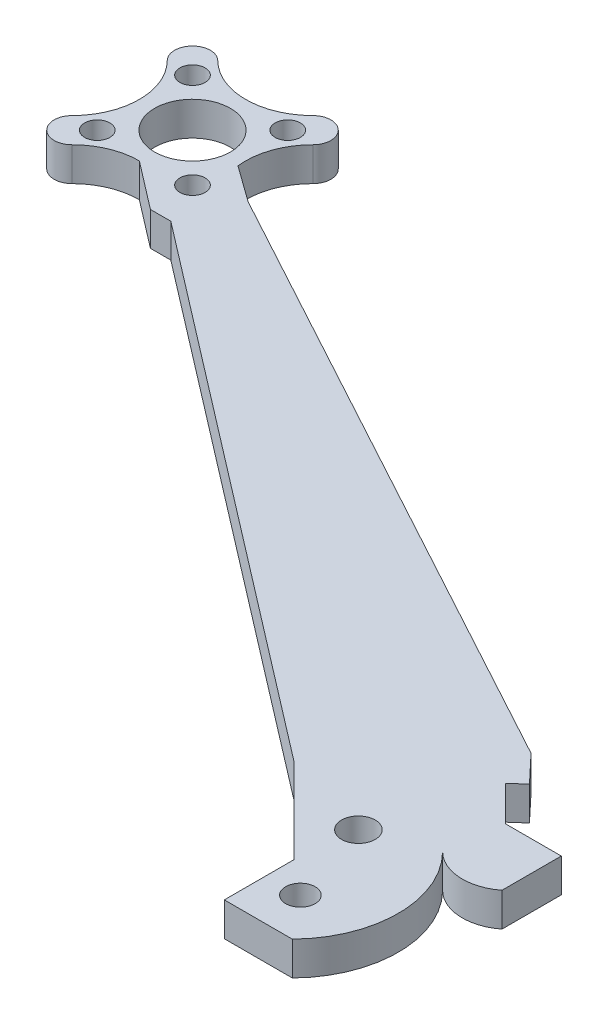
ISO-10303-21;
HEADER;
FILE_DESCRIPTION(('STEP AP214'),'2;1');
FILE_NAME('part.step','',(''),(''),'','','');
FILE_SCHEMA(('AUTOMOTIVE_DESIGN { 1 0 10303 214 1 1 1 1 }'));
ENDSEC;
DATA;
#1=APPLICATION_CONTEXT('core data for automotive mechanical design processes');
#2=APPLICATION_PROTOCOL_DEFINITION('international standard','automotive_design',2000,#1);
#3=PRODUCT_CONTEXT('',#1,'mechanical');
#4=PRODUCT('Part','Part','',(#3));
#5=PRODUCT_RELATED_PRODUCT_CATEGORY('part','',(#4));
#6=PRODUCT_DEFINITION_FORMATION('','',#4);
#7=PRODUCT_DEFINITION_CONTEXT('part definition',#1,'design');
#8=PRODUCT_DEFINITION('design','',#6,#7);
#9=PRODUCT_DEFINITION_SHAPE('','',#8);
#10=(LENGTH_UNIT() NAMED_UNIT(*) SI_UNIT(.MILLI.,.METRE.));
#11=(NAMED_UNIT(*) PLANE_ANGLE_UNIT() SI_UNIT($,.RADIAN.));
#12=(NAMED_UNIT(*) SI_UNIT($,.STERADIAN.) SOLID_ANGLE_UNIT());
#13=UNCERTAINTY_MEASURE_WITH_UNIT(LENGTH_MEASURE(1.E-05),#10,'distance_accuracy_value','');
#14=(GEOMETRIC_REPRESENTATION_CONTEXT(3) GLOBAL_UNCERTAINTY_ASSIGNED_CONTEXT((#13)) GLOBAL_UNIT_ASSIGNED_CONTEXT((#10,
#11,#12)) REPRESENTATION_CONTEXT('',''));
#15=CARTESIAN_POINT('',(0.,0.,0.));
#16=DIRECTION('',(0.,0.,1.));
#17=DIRECTION('',(1.,0.,0.));
#18=AXIS2_PLACEMENT_3D('',#15,#16,#17);
#19=CARTESIAN_POINT('',(0.,4.,0.));
#20=DIRECTION('',(0.,1.,0.));
#21=DIRECTION('',(0.,0.,1.));
#22=AXIS2_PLACEMENT_3D('',#19,#20,#21);
#23=PLANE('',#22);
#24=CARTESIAN_POINT('',(85.0978041056994,4.,72.2825680687124));
#25=DIRECTION('',(0.,-1.,0.));
#26=DIRECTION('',(0.,0.,-1.));
#27=AXIS2_PLACEMENT_3D('',#24,#25,#26);
#28=CIRCLE('',#27,1.75);
#29=CARTESIAN_POINT('',(85.0978041056994,4.,70.5325680687124));
#30=VERTEX_POINT('',#29);
#31=EDGE_CURVE('E846',#30,#30,#28,.T.);
#32=ORIENTED_EDGE('',*,*,#31,.T.);
#33=EDGE_LOOP('',(#32));
#34=FACE_BOUND('',#33,.T.);
#35=CARTESIAN_POINT('',(81.80780567727,4.,62.1037977929157));
#36=DIRECTION('',(0.,1.,0.));
#37=DIRECTION('',(0.,0.,1.));
#38=AXIS2_PLACEMENT_3D('',#35,#36,#37);
#39=CIRCLE('',#38,1.99999999999999);
#40=CARTESIAN_POINT('',(81.80780567727,4.,64.1037977929157));
#41=VERTEX_POINT('',#40);
#42=EDGE_CURVE('E223',#41,#41,#39,.T.);
#43=ORIENTED_EDGE('',*,*,#42,.F.);
#44=EDGE_LOOP('',(#43));
#45=FACE_BOUND('',#44,.T.);
#46=CARTESIAN_POINT('',(-5.65685424949232,4.,-5.65685424949244));
#47=DIRECTION('',(0.,1.,0.));
#48=DIRECTION('',(0.,0.,1.));
#49=AXIS2_PLACEMENT_3D('',#46,#47,#48);
#50=CIRCLE('',#49,1.5);
#51=CARTESIAN_POINT('',(-5.65685424949232,4.,-4.15685424949244));
#52=VERTEX_POINT('',#51);
#53=EDGE_CURVE('E442',#52,#52,#50,.T.);
#54=ORIENTED_EDGE('',*,*,#53,.F.);
#55=EDGE_LOOP('',(#54));
#56=FACE_BOUND('',#55,.T.);
#57=CARTESIAN_POINT('',(-5.65685424949242,4.,5.65685424949234));
#58=DIRECTION('',(0.,1.,0.));
#59=DIRECTION('',(0.,0.,1.));
#60=AXIS2_PLACEMENT_3D('',#57,#58,#59);
#61=CIRCLE('',#60,1.5);
#62=CARTESIAN_POINT('',(-5.65685424949242,4.,7.15685424949234));
#63=VERTEX_POINT('',#62);
#64=EDGE_CURVE('E434',#63,#63,#61,.T.);
#65=ORIENTED_EDGE('',*,*,#64,.F.);
#66=EDGE_LOOP('',(#65));
#67=FACE_BOUND('',#66,.T.);
#68=CARTESIAN_POINT('',(5.65685424949238,4.,-5.65685424949238));
#69=DIRECTION('',(0.,1.,0.));
#70=DIRECTION('',(0.,0.,1.));
#71=AXIS2_PLACEMENT_3D('',#68,#69,#70);
#72=CIRCLE('',#71,1.5);
#73=CARTESIAN_POINT('',(5.65685424949238,4.,-4.15685424949238));
#74=VERTEX_POINT('',#73);
#75=EDGE_CURVE('E427',#74,#74,#72,.T.);
#76=ORIENTED_EDGE('',*,*,#75,.F.);
#77=EDGE_LOOP('',(#76));
#78=FACE_BOUND('',#77,.T.);
#79=CARTESIAN_POINT('',(0.,4.,0.));
#80=DIRECTION('',(0.,1.,0.));
#81=DIRECTION('',(0.,0.,1.));
#82=AXIS2_PLACEMENT_3D('',#79,#80,#81);
#83=CIRCLE('',#82,4.5);
#84=CARTESIAN_POINT('',(0.,4.,4.5));
#85=VERTEX_POINT('',#84);
#86=EDGE_CURVE('E456',#85,#85,#83,.T.);
#87=ORIENTED_EDGE('',*,*,#86,.F.);
#88=EDGE_LOOP('',(#87));
#89=FACE_BOUND('',#88,.T.);
#90=CARTESIAN_POINT('',(5.65685424949236,4.,5.6568542494924));
#91=DIRECTION('',(0.,1.,0.));
#92=DIRECTION('',(0.,0.,1.));
#93=AXIS2_PLACEMENT_3D('',#90,#91,#92);
#94=CIRCLE('',#93,1.5);
#95=CARTESIAN_POINT('',(5.65685424949236,4.,7.1568542494924));
#96=VERTEX_POINT('',#95);
#97=EDGE_CURVE('E428',#96,#96,#94,.T.);
#98=ORIENTED_EDGE('',*,*,#97,.F.);
#99=EDGE_LOOP('',(#98));
#100=FACE_BOUND('',#99,.T.);
#101=CARTESIAN_POINT('',(80.0614070112013,4.,68.3559558555536));
#102=DIRECTION('',(0.,-1.,0.));
#103=DIRECTION('',(0.,0.,-1.));
#104=AXIS2_PLACEMENT_3D('',#101,#102,#103);
#105=CIRCLE('',#104,12.7279220613578);
#106=CARTESIAN_POINT('',(89.0614070112014,4.,59.3559558555538));
#107=VERTEX_POINT('',#106);
#108=CARTESIAN_POINT('',(89.1342012001975,4.,77.2825680687124));
#109=VERTEX_POINT('',#108);
#110=EDGE_CURVE('E65',#107,#109,#105,.T.);
#111=ORIENTED_EDGE('',*,*,#110,.F.);
#112=CARTESIAN_POINT('',(93.0614070112013,4.,55.3559558555539));
#113=DIRECTION('',(0.,1.,0.));
#114=DIRECTION('',(0.,0.,1.));
#115=AXIS2_PLACEMENT_3D('',#112,#113,#114);
#116=CIRCLE('',#115,5.65685424949223);
#117=CARTESIAN_POINT('',(96.5614070112013,4.,59.8000530642115));
#118=VERTEX_POINT('',#117);
#119=EDGE_CURVE('E205',#107,#118,#116,.T.);
#120=ORIENTED_EDGE('',*,*,#119,.T.);
#121=DIRECTION('',(0.,0.,-1.));
#122=VECTOR('',#121,1.);
#123=CARTESIAN_POINT('',(96.5614070112013,4.,52.7610345676334));
#124=LINE('',#123,#122);
#125=CARTESIAN_POINT('',(96.5614070112013,4.,52.7610345676334));
#126=VERTEX_POINT('',#125);
#127=EDGE_CURVE('E332',#118,#126,#124,.T.);
#128=ORIENTED_EDGE('',*,*,#127,.T.);
#129=DIRECTION('',(1.,0.,0.));
#130=VECTOR('',#129,1.);
#131=CARTESIAN_POINT('',(90.5019503136648,4.,52.7610345676334));
#132=LINE('',#131,#130);
#133=CARTESIAN_POINT('',(89.9608894690823,4.,52.7610345676334));
#134=VERTEX_POINT('',#133);
#135=EDGE_CURVE('E354',#134,#126,#132,.T.);
#136=ORIENTED_EDGE('',*,*,#135,.F.);
#137=DIRECTION('',(0.707331619227857,0.,0.706881871630966));
#138=VECTOR('',#137,1.);
#139=CARTESIAN_POINT('',(85.7805147252344,4.,48.5833178606157));
#140=LINE('',#139,#138);
#141=CARTESIAN_POINT('',(85.7805147252344,4.,48.5833178606157));
#142=VERTEX_POINT('',#141);
#143=EDGE_CURVE('E366',#142,#134,#140,.T.);
#144=ORIENTED_EDGE('',*,*,#143,.F.);
#145=DIRECTION('',(-0.749062373849123,0.,0.66249947930811));
#146=VECTOR('',#145,1.);
#147=CARTESIAN_POINT('',(87.2786394729325,4.,47.2583189019996));
#148=LINE('',#147,#146);
#149=CARTESIAN_POINT('',(87.2786394729325,4.,47.2583189019996));
#150=VERTEX_POINT('',#149);
#151=EDGE_CURVE('E348',#150,#142,#148,.T.);
#152=ORIENTED_EDGE('',*,*,#151,.F.);
#153=DIRECTION('',(-0.685611663685296,0.,-0.727967476346767));
#154=VECTOR('',#153,1.);
#155=CARTESIAN_POINT('',(87.2786394729325,4.,47.2583189019996));
#156=LINE('',#155,#154);
#157=CARTESIAN_POINT('',(84.1934838147439,4.,43.9825680687124));
#158=VERTEX_POINT('',#157);
#159=EDGE_CURVE('E291',#150,#158,#156,.T.);
#160=ORIENTED_EDGE('',*,*,#159,.T.);
#161=DIRECTION('',(-0.878817112661968,0.,-0.477158760259604));
#162=VECTOR('',#161,1.);
#163=CARTESIAN_POINT('',(84.1934838147439,4.,43.9825680687124));
#164=LINE('',#163,#162);
#165=CARTESIAN_POINT('',(10.655,4.,4.05442913872873));
#166=VERTEX_POINT('',#165);
#167=EDGE_CURVE('E380',#158,#166,#164,.T.);
#168=ORIENTED_EDGE('',*,*,#167,.T.);
#169=DIRECTION('',(-0.811476008534574,0.,-0.584385735257797));
#170=VECTOR('',#169,1.);
#171=CARTESIAN_POINT('',(6.37280582790223,4.,0.970600210382307));
#172=LINE('',#171,#170);
#173=CARTESIAN_POINT('',(6.37280582790223,4.,0.970600210382307));
#174=VERTEX_POINT('',#173);
#175=EDGE_CURVE('E203',#166,#174,#172,.T.);
#176=ORIENTED_EDGE('',*,*,#175,.T.);
#177=CARTESIAN_POINT('',(14.3137084989848,4.,0.));
#178=DIRECTION('',(0.,-1.,0.));
#179=DIRECTION('',(0.,0.,1.));
#180=AXIS2_PLACEMENT_3D('',#177,#178,#179);
#181=CIRCLE('',#180,7.99999999999998);
#182=CARTESIAN_POINT('',(8.65685424949238,4.,-5.65685424949238));
#183=VERTEX_POINT('',#182);
#184=EDGE_CURVE('E300',#174,#183,#181,.T.);
#185=ORIENTED_EDGE('',*,*,#184,.T.);
#186=CARTESIAN_POINT('',(7.15685424949238,4.,-7.15685424949241));
#187=DIRECTION('',(0.,1.,0.));
#188=DIRECTION('',(0.,0.,-1.));
#189=AXIS2_PLACEMENT_3D('',#186,#187,#188);
#190=CIRCLE('',#189,2.12132034355966);
#191=CARTESIAN_POINT('',(5.65685424949238,4.,-8.65685424949244));
#192=VERTEX_POINT('',#191);
#193=EDGE_CURVE('E297',#183,#192,#190,.T.);
#194=ORIENTED_EDGE('',*,*,#193,.T.);
#195=CARTESIAN_POINT('',(0.,4.,-14.3137084989848));
#196=DIRECTION('',(0.,-1.,0.));
#197=DIRECTION('',(0.,0.,-1.));
#198=AXIS2_PLACEMENT_3D('',#195,#196,#197);
#199=CIRCLE('',#198,7.99999999999996);
#200=CARTESIAN_POINT('',(-5.65685424949232,4.,-8.65685424949244));
#201=VERTEX_POINT('',#200);
#202=EDGE_CURVE('E255',#192,#201,#199,.T.);
#203=ORIENTED_EDGE('',*,*,#202,.T.);
#204=CARTESIAN_POINT('',(-7.15685424949232,4.,-7.15685424949244));
#205=DIRECTION('',(0.,1.,0.));
#206=DIRECTION('',(0.,0.,-1.));
#207=AXIS2_PLACEMENT_3D('',#204,#205,#206);
#208=CIRCLE('',#207,2.12132034355964);
#209=CARTESIAN_POINT('',(-8.65685424949232,4.,-5.65685424949244));
#210=VERTEX_POINT('',#209);
#211=EDGE_CURVE('E244',#201,#210,#208,.T.);
#212=ORIENTED_EDGE('',*,*,#211,.T.);
#213=CARTESIAN_POINT('',(-14.3137084989847,4.,0.));
#214=DIRECTION('',(0.,-1.,0.));
#215=DIRECTION('',(0.,0.,-1.));
#216=AXIS2_PLACEMENT_3D('',#213,#214,#215);
#217=CIRCLE('',#216,8.00000000000002);
#218=CARTESIAN_POINT('',(-8.65685424949232,4.,5.65685424949234));
#219=VERTEX_POINT('',#218);
#220=EDGE_CURVE('E283',#210,#219,#217,.T.);
#221=ORIENTED_EDGE('',*,*,#220,.T.);
#222=CARTESIAN_POINT('',(-7.15685424949237,4.,7.15685424949234));
#223=DIRECTION('',(0.,1.,0.));
#224=DIRECTION('',(0.,0.,1.));
#225=AXIS2_PLACEMENT_3D('',#222,#223,#224);
#226=CIRCLE('',#225,2.12132034355961);
#227=CARTESIAN_POINT('',(-5.65685424949242,4.,8.65685424949234));
#228=VERTEX_POINT('',#227);
#229=EDGE_CURVE('E284',#219,#228,#226,.T.);
#230=ORIENTED_EDGE('',*,*,#229,.T.);
#231=CARTESIAN_POINT('',(0.,4.,14.3137084989848));
#232=DIRECTION('',(0.,-1.,0.));
#233=DIRECTION('',(0.,0.,-1.));
#234=AXIS2_PLACEMENT_3D('',#231,#232,#233);
#235=CIRCLE('',#234,8.00000000000003);
#236=CARTESIAN_POINT('',(0.,4.,6.31370849898472));
#237=VERTEX_POINT('',#236);
#238=EDGE_CURVE('E288',#228,#237,#235,.T.);
#239=ORIENTED_EDGE('',*,*,#238,.T.);
#240=DIRECTION('',(0.793310358918495,0.,0.608817439330222));
#241=VECTOR('',#240,1.);
#242=CARTESIAN_POINT('',(5.65685424949236,4.,10.655));
#243=LINE('',#242,#241);
#244=CARTESIAN_POINT('',(5.65685424949236,4.,10.655));
#245=VERTEX_POINT('',#244);
#246=EDGE_CURVE('E235',#237,#245,#243,.T.);
#247=ORIENTED_EDGE('',*,*,#246,.T.);
#248=DIRECTION('',(1.,0.,0.));
#249=VECTOR('',#248,1.);
#250=CARTESIAN_POINT('',(0.,4.,10.655));
#251=LINE('',#250,#249);
#252=CARTESIAN_POINT('',(8.07969409634453,4.,10.655));
#253=VERTEX_POINT('',#252);
#254=EDGE_CURVE('E411',#245,#253,#251,.T.);
#255=ORIENTED_EDGE('',*,*,#254,.T.);
#256=DIRECTION('',(0.793353340291236,0.,0.60876142900872));
#257=VECTOR('',#256,1.);
#258=CARTESIAN_POINT('',(71.0614070112013,4.,58.9825680687125));
#259=LINE('',#258,#257);
#260=CARTESIAN_POINT('',(71.0614070112013,4.,58.9825680687125));
#261=VERTEX_POINT('',#260);
#262=EDGE_CURVE('E402',#253,#261,#259,.T.);
#263=ORIENTED_EDGE('',*,*,#262,.T.);
#264=DIRECTION('',(0.707106781186547,0.,0.707106781186548));
#265=VECTOR('',#264,1.);
#266=CARTESIAN_POINT('',(71.0614070112013,4.,58.9825680687125));
#267=LINE('',#266,#265);
#268=CARTESIAN_POINT('',(81.0614070112013,4.,68.9825680687125));
#269=VERTEX_POINT('',#268);
#270=EDGE_CURVE('E404',#261,#269,#267,.T.);
#271=ORIENTED_EDGE('',*,*,#270,.T.);
#272=DIRECTION('',(0.,0.,1.));
#273=VECTOR('',#272,1.);
#274=CARTESIAN_POINT('',(81.0614070112013,4.,68.9825680687125));
#275=LINE('',#274,#273);
#276=CARTESIAN_POINT('',(81.0614070112013,4.,77.2825680687124));
#277=VERTEX_POINT('',#276);
#278=EDGE_CURVE('E386',#269,#277,#275,.T.);
#279=ORIENTED_EDGE('',*,*,#278,.T.);
#280=DIRECTION('',(1.,0.,0.));
#281=VECTOR('',#280,1.);
#282=CARTESIAN_POINT('',(81.0614070112013,4.,77.2825680687124));
#283=LINE('',#282,#281);
#284=EDGE_CURVE('E309',#277,#109,#283,.T.);
#285=ORIENTED_EDGE('',*,*,#284,.T.);
#286=EDGE_LOOP('',(#111,#120,#128,#136,#144,#152,#160,#168,#176,#185,#194,#203,#212,#221,#230,
#239,#247,#255,#263,#271,#279,#285));
#287=FACE_BOUND('',#286,.T.);
#288=ADVANCED_FACE('F50',(#34,#45,#56,#67,#78,#89,#100,#287),#23,.T.);
#289=CARTESIAN_POINT('',(96.5614070112013,0.,52.7610345676334));
#290=DIRECTION('',(1.,0.,0.));
#291=DIRECTION('',(0.,0.,-1.));
#292=AXIS2_PLACEMENT_3D('',#289,#290,#291);
#293=PLANE('',#292);
#294=ORIENTED_EDGE('',*,*,#127,.F.);
#295=DIRECTION('',(0.,1.,0.));
#296=VECTOR('',#295,1.);
#297=CARTESIAN_POINT('',(96.5614070112013,0.,59.8000530642115));
#298=LINE('',#297,#296);
#299=CARTESIAN_POINT('',(96.5614070112013,0.,59.8000530642115));
#300=VERTEX_POINT('',#299);
#301=EDGE_CURVE('E12',#118,#300,#298,.F.);
#302=ORIENTED_EDGE('',*,*,#301,.T.);
#303=DIRECTION('',(0.,0.,-1.));
#304=VECTOR('',#303,1.);
#305=CARTESIAN_POINT('',(96.5614070112013,0.,52.7610345676334));
#306=LINE('',#305,#304);
#307=CARTESIAN_POINT('',(96.5614070112013,0.,52.7610345676334));
#308=VERTEX_POINT('',#307);
#309=EDGE_CURVE('E220',#300,#308,#306,.T.);
#310=ORIENTED_EDGE('',*,*,#309,.T.);
#311=DIRECTION('',(0.,1.,0.));
#312=VECTOR('',#311,1.);
#313=CARTESIAN_POINT('',(96.5614070112013,0.,52.7610345676334));
#314=LINE('',#313,#312);
#315=EDGE_CURVE('E341',#308,#126,#314,.T.);
#316=ORIENTED_EDGE('',*,*,#315,.T.);
#317=EDGE_LOOP('',(#294,#302,#310,#316));
#318=FACE_BOUND('',#317,.T.);
#319=ADVANCED_FACE('F543',(#318),#293,.T.);
#320=CARTESIAN_POINT('',(0.,0.,0.));
#321=DIRECTION('',(0.,1.,0.));
#322=DIRECTION('',(0.,0.,1.));
#323=AXIS2_PLACEMENT_3D('',#320,#321,#322);
#324=PLANE('',#323);
#325=CARTESIAN_POINT('',(85.0978041056994,0.,72.2825680687124));
#326=DIRECTION('',(0.,-1.,0.));
#327=DIRECTION('',(0.,0.,-1.));
#328=AXIS2_PLACEMENT_3D('',#325,#326,#327);
#329=CIRCLE('',#328,1.75);
#330=CARTESIAN_POINT('',(85.0978041056994,0.,70.5325680687124));
#331=VERTEX_POINT('',#330);
#332=EDGE_CURVE('E841',#331,#331,#329,.T.);
#333=ORIENTED_EDGE('',*,*,#332,.F.);
#334=EDGE_LOOP('',(#333));
#335=FACE_BOUND('',#334,.T.);
#336=CARTESIAN_POINT('',(81.80780567727,0.,62.1037977929157));
#337=DIRECTION('',(0.,-1.,0.));
#338=DIRECTION('',(0.,0.,-1.));
#339=AXIS2_PLACEMENT_3D('',#336,#337,#338);
#340=CIRCLE('',#339,1.99999999999999);
#341=CARTESIAN_POINT('',(81.80780567727,0.,60.1037977929157));
#342=VERTEX_POINT('',#341);
#343=EDGE_CURVE('E842',#342,#342,#340,.T.);
#344=ORIENTED_EDGE('',*,*,#343,.F.);
#345=EDGE_LOOP('',(#344));
#346=FACE_BOUND('',#345,.T.);
#347=CARTESIAN_POINT('',(93.0614070112013,0.,55.3559558555539));
#348=DIRECTION('',(0.,1.,0.));
#349=DIRECTION('',(0.,0.,1.));
#350=AXIS2_PLACEMENT_3D('',#347,#348,#349);
#351=CIRCLE('',#350,5.65685424949223);
#352=CARTESIAN_POINT('',(89.0614070112014,0.,59.3559558555538));
#353=VERTEX_POINT('',#352);
#354=EDGE_CURVE('E199',#353,#300,#351,.T.);
#355=ORIENTED_EDGE('',*,*,#354,.F.);
#356=CARTESIAN_POINT('',(80.0614070112013,0.,68.3559558555536));
#357=DIRECTION('',(0.,-1.,0.));
#358=DIRECTION('',(0.,0.,-1.));
#359=AXIS2_PLACEMENT_3D('',#356,#357,#358);
#360=CIRCLE('',#359,12.7279220613578);
#361=CARTESIAN_POINT('',(89.1342012001975,0.,77.2825680687124));
#362=VERTEX_POINT('',#361);
#363=EDGE_CURVE('E210',#353,#362,#360,.T.);
#364=ORIENTED_EDGE('',*,*,#363,.T.);
#365=DIRECTION('',(1.,0.,0.));
#366=VECTOR('',#365,1.);
#367=CARTESIAN_POINT('',(81.0614070112013,0.,77.2825680687124));
#368=LINE('',#367,#366);
#369=CARTESIAN_POINT('',(81.0614070112013,0.,77.2825680687124));
#370=VERTEX_POINT('',#369);
#371=EDGE_CURVE('E329',#370,#362,#368,.T.);
#372=ORIENTED_EDGE('',*,*,#371,.F.);
#373=DIRECTION('',(0.,0.,1.));
#374=VECTOR('',#373,1.);
#375=CARTESIAN_POINT('',(81.0614070112013,0.,68.9825680687125));
#376=LINE('',#375,#374);
#377=CARTESIAN_POINT('',(81.0614070112013,0.,68.9825680687125));
#378=VERTEX_POINT('',#377);
#379=EDGE_CURVE('E392',#378,#370,#376,.T.);
#380=ORIENTED_EDGE('',*,*,#379,.F.);
#381=DIRECTION('',(0.707106781186547,0.,0.707106781186548));
#382=VECTOR('',#381,1.);
#383=CARTESIAN_POINT('',(71.0614070112013,0.,58.9825680687125));
#384=LINE('',#383,#382);
#385=CARTESIAN_POINT('',(71.0614070112013,0.,58.9825680687125));
#386=VERTEX_POINT('',#385);
#387=EDGE_CURVE('E387',#386,#378,#384,.T.);
#388=ORIENTED_EDGE('',*,*,#387,.F.);
#389=DIRECTION('',(0.793353340291236,0.,0.60876142900872));
#390=VECTOR('',#389,1.);
#391=CARTESIAN_POINT('',(71.0614070112013,0.,58.9825680687125));
#392=LINE('',#391,#390);
#393=CARTESIAN_POINT('',(8.07969409634453,0.,10.655));
#394=VERTEX_POINT('',#393);
#395=EDGE_CURVE('E389',#394,#386,#392,.T.);
#396=ORIENTED_EDGE('',*,*,#395,.F.);
#397=DIRECTION('',(1.,0.,0.));
#398=VECTOR('',#397,1.);
#399=CARTESIAN_POINT('',(0.,0.,10.655));
#400=LINE('',#399,#398);
#401=CARTESIAN_POINT('',(5.65685424949236,0.,10.655));
#402=VERTEX_POINT('',#401);
#403=EDGE_CURVE('E419',#402,#394,#400,.T.);
#404=ORIENTED_EDGE('',*,*,#403,.F.);
#405=DIRECTION('',(0.793310358918495,0.,0.608817439330222));
#406=VECTOR('',#405,1.);
#407=CARTESIAN_POINT('',(5.65685424949236,0.,10.655));
#408=LINE('',#407,#406);
#409=CARTESIAN_POINT('',(0.,0.,6.31370849898472));
#410=VERTEX_POINT('',#409);
#411=EDGE_CURVE('E233',#410,#402,#408,.T.);
#412=ORIENTED_EDGE('',*,*,#411,.F.);
#413=CARTESIAN_POINT('',(0.,0.,14.3137084989848));
#414=DIRECTION('',(0.,-1.,0.));
#415=DIRECTION('',(0.,0.,-1.));
#416=AXIS2_PLACEMENT_3D('',#413,#414,#415);
#417=CIRCLE('',#416,8.00000000000003);
#418=CARTESIAN_POINT('',(-5.65685424949242,0.,8.65685424949234));
#419=VERTEX_POINT('',#418);
#420=EDGE_CURVE('E257',#419,#410,#417,.T.);
#421=ORIENTED_EDGE('',*,*,#420,.F.);
#422=CARTESIAN_POINT('',(-7.15685424949237,0.,7.15685424949234));
#423=DIRECTION('',(0.,1.,0.));
#424=DIRECTION('',(0.,0.,1.));
#425=AXIS2_PLACEMENT_3D('',#422,#423,#424);
#426=CIRCLE('',#425,2.12132034355961);
#427=CARTESIAN_POINT('',(-8.65685424949232,0.,5.65685424949234));
#428=VERTEX_POINT('',#427);
#429=EDGE_CURVE('E259',#428,#419,#426,.T.);
#430=ORIENTED_EDGE('',*,*,#429,.F.);
#431=CARTESIAN_POINT('',(-14.3137084989847,0.,0.));
#432=DIRECTION('',(0.,-1.,0.));
#433=DIRECTION('',(0.,0.,-1.));
#434=AXIS2_PLACEMENT_3D('',#431,#432,#433);
#435=CIRCLE('',#434,8.00000000000002);
#436=CARTESIAN_POINT('',(-8.65685424949232,0.,-5.65685424949244));
#437=VERTEX_POINT('',#436);
#438=EDGE_CURVE('E252',#437,#428,#435,.T.);
#439=ORIENTED_EDGE('',*,*,#438,.F.);
#440=CARTESIAN_POINT('',(-7.15685424949232,0.,-7.15685424949244));
#441=DIRECTION('',(0.,1.,0.));
#442=DIRECTION('',(0.,0.,-1.));
#443=AXIS2_PLACEMENT_3D('',#440,#441,#442);
#444=CIRCLE('',#443,2.12132034355964);
#445=CARTESIAN_POINT('',(-5.65685424949232,0.,-8.65685424949244));
#446=VERTEX_POINT('',#445);
#447=EDGE_CURVE('E247',#446,#437,#444,.T.);
#448=ORIENTED_EDGE('',*,*,#447,.F.);
#449=CARTESIAN_POINT('',(0.,0.,-14.3137084989848));
#450=DIRECTION('',(0.,-1.,0.));
#451=DIRECTION('',(0.,0.,-1.));
#452=AXIS2_PLACEMENT_3D('',#449,#450,#451);
#453=CIRCLE('',#452,7.99999999999996);
#454=CARTESIAN_POINT('',(5.65685424949238,0.,-8.65685424949244));
#455=VERTEX_POINT('',#454);
#456=EDGE_CURVE('E271',#455,#446,#453,.T.);
#457=ORIENTED_EDGE('',*,*,#456,.F.);
#458=CARTESIAN_POINT('',(7.15685424949238,0.,-7.15685424949241));
#459=DIRECTION('',(0.,1.,0.));
#460=DIRECTION('',(0.,0.,-1.));
#461=AXIS2_PLACEMENT_3D('',#458,#459,#460);
#462=CIRCLE('',#461,2.12132034355966);
#463=CARTESIAN_POINT('',(8.65685424949238,0.,-5.65685424949238));
#464=VERTEX_POINT('',#463);
#465=EDGE_CURVE('E268',#464,#455,#462,.T.);
#466=ORIENTED_EDGE('',*,*,#465,.F.);
#467=CARTESIAN_POINT('',(14.3137084989848,0.,0.));
#468=DIRECTION('',(0.,-1.,0.));
#469=DIRECTION('',(0.,0.,1.));
#470=AXIS2_PLACEMENT_3D('',#467,#468,#469);
#471=CIRCLE('',#470,7.99999999999998);
#472=CARTESIAN_POINT('',(6.37280582790223,0.,0.970600210382307));
#473=VERTEX_POINT('',#472);
#474=EDGE_CURVE('E266',#473,#464,#471,.T.);
#475=ORIENTED_EDGE('',*,*,#474,.F.);
#476=DIRECTION('',(-0.811476008534574,0.,-0.584385735257797));
#477=VECTOR('',#476,1.);
#478=CARTESIAN_POINT('',(6.37280582790223,0.,0.970600210382307));
#479=LINE('',#478,#477);
#480=CARTESIAN_POINT('',(10.655,0.,4.05442913872873));
#481=VERTEX_POINT('',#480);
#482=EDGE_CURVE('E227',#481,#473,#479,.T.);
#483=ORIENTED_EDGE('',*,*,#482,.F.);
#484=DIRECTION('',(-0.878817112661968,0.,-0.477158760259604));
#485=VECTOR('',#484,1.);
#486=CARTESIAN_POINT('',(84.1934838147439,0.,43.9825680687124));
#487=LINE('',#486,#485);
#488=CARTESIAN_POINT('',(84.1934838147439,0.,43.9825680687124));
#489=VERTEX_POINT('',#488);
#490=EDGE_CURVE('E384',#489,#481,#487,.T.);
#491=ORIENTED_EDGE('',*,*,#490,.F.);
#492=DIRECTION('',(-0.685611663685296,0.,-0.727967476346767));
#493=VECTOR('',#492,1.);
#494=CARTESIAN_POINT('',(87.2786394729325,0.,47.2583189019996));
#495=LINE('',#494,#493);
#496=CARTESIAN_POINT('',(87.2786394729325,0.,47.2583189019996));
#497=VERTEX_POINT('',#496);
#498=EDGE_CURVE('E261',#497,#489,#495,.T.);
#499=ORIENTED_EDGE('',*,*,#498,.F.);
#500=DIRECTION('',(-0.749062373849123,0.,0.66249947930811));
#501=VECTOR('',#500,1.);
#502=CARTESIAN_POINT('',(87.2786394729325,0.,47.2583189019996));
#503=LINE('',#502,#501);
#504=CARTESIAN_POINT('',(85.7805147252344,0.,48.5833178606157));
#505=VERTEX_POINT('',#504);
#506=EDGE_CURVE('E349',#497,#505,#503,.T.);
#507=ORIENTED_EDGE('',*,*,#506,.T.);
#508=DIRECTION('',(0.707331619227857,0.,0.706881871630966));
#509=VECTOR('',#508,1.);
#510=CARTESIAN_POINT('',(85.7805147252344,0.,48.5833178606157));
#511=LINE('',#510,#509);
#512=CARTESIAN_POINT('',(89.9608894690823,0.,52.7610345676334));
#513=VERTEX_POINT('',#512);
#514=EDGE_CURVE('E353',#505,#513,#511,.T.);
#515=ORIENTED_EDGE('',*,*,#514,.T.);
#516=DIRECTION('',(1.,0.,0.));
#517=VECTOR('',#516,1.);
#518=CARTESIAN_POINT('',(89.9608894690823,0.,52.7610345676334));
#519=LINE('',#518,#517);
#520=EDGE_CURVE('E360',#513,#308,#519,.T.);
#521=ORIENTED_EDGE('',*,*,#520,.T.);
#522=ORIENTED_EDGE('',*,*,#309,.F.);
#523=EDGE_LOOP('',(#355,#364,#372,#380,#388,#396,#404,#412,#421,#430,#439,#448,#457,#466,#475,
#483,#491,#499,#507,#515,#521,#522));
#524=FACE_BOUND('',#523,.T.);
#525=CARTESIAN_POINT('',(-5.65685424949232,0.,-5.65685424949244));
#526=DIRECTION('',(0.,1.,0.));
#527=DIRECTION('',(0.,0.,1.));
#528=AXIS2_PLACEMENT_3D('',#525,#526,#527);
#529=CIRCLE('',#528,1.5);
#530=CARTESIAN_POINT('',(-5.65685424949232,0.,-4.15685424949244));
#531=VERTEX_POINT('',#530);
#532=EDGE_CURVE('E421',#531,#531,#529,.T.);
#533=ORIENTED_EDGE('',*,*,#532,.T.);
#534=EDGE_LOOP('',(#533));
#535=FACE_BOUND('',#534,.T.);
#536=CARTESIAN_POINT('',(-5.65685424949242,0.,5.65685424949234));
#537=DIRECTION('',(0.,1.,0.));
#538=DIRECTION('',(0.,0.,1.));
#539=AXIS2_PLACEMENT_3D('',#536,#537,#538);
#540=CIRCLE('',#539,1.5);
#541=CARTESIAN_POINT('',(-5.65685424949242,0.,7.15685424949234));
#542=VERTEX_POINT('',#541);
#543=EDGE_CURVE('E437',#542,#542,#540,.T.);
#544=ORIENTED_EDGE('',*,*,#543,.T.);
#545=EDGE_LOOP('',(#544));
#546=FACE_BOUND('',#545,.T.);
#547=CARTESIAN_POINT('',(5.65685424949238,0.,-5.65685424949238));
#548=DIRECTION('',(0.,1.,0.));
#549=DIRECTION('',(0.,0.,1.));
#550=AXIS2_PLACEMENT_3D('',#547,#548,#549);
#551=CIRCLE('',#550,1.5);
#552=CARTESIAN_POINT('',(5.65685424949238,0.,-4.15685424949238));
#553=VERTEX_POINT('',#552);
#554=EDGE_CURVE('E448',#553,#553,#551,.T.);
#555=ORIENTED_EDGE('',*,*,#554,.T.);
#556=EDGE_LOOP('',(#555));
#557=FACE_BOUND('',#556,.T.);
#558=CARTESIAN_POINT('',(0.,0.,0.));
#559=DIRECTION('',(0.,1.,0.));
#560=DIRECTION('',(0.,0.,1.));
#561=AXIS2_PLACEMENT_3D('',#558,#559,#560);
#562=CIRCLE('',#561,4.5);
#563=CARTESIAN_POINT('',(0.,0.,4.5));
#564=VERTEX_POINT('',#563);
#565=EDGE_CURVE('E453',#564,#564,#562,.T.);
#566=ORIENTED_EDGE('',*,*,#565,.T.);
#567=EDGE_LOOP('',(#566));
#568=FACE_BOUND('',#567,.T.);
#569=CARTESIAN_POINT('',(5.65685424949236,0.,5.6568542494924));
#570=DIRECTION('',(0.,1.,0.));
#571=DIRECTION('',(0.,0.,1.));
#572=AXIS2_PLACEMENT_3D('',#569,#570,#571);
#573=CIRCLE('',#572,1.5);
#574=CARTESIAN_POINT('',(5.65685424949236,0.,7.1568542494924));
#575=VERTEX_POINT('',#574);
#576=EDGE_CURVE('E431',#575,#575,#573,.T.);
#577=ORIENTED_EDGE('',*,*,#576,.T.);
#578=EDGE_LOOP('',(#577));
#579=FACE_BOUND('',#578,.T.);
#580=ADVANCED_FACE('F47',(#335,#346,#524,#535,#546,#557,#568,#579),#324,.F.);
#581=CARTESIAN_POINT('',(0.,4.,0.));
#582=DIRECTION('',(0.,-1.,0.));
#583=DIRECTION('',(0.,0.,-1.));
#584=AXIS2_PLACEMENT_3D('',#581,#582,#583);
#585=CYLINDRICAL_SURFACE('',#584,4.5);
#586=ORIENTED_EDGE('',*,*,#86,.T.);
#587=EDGE_LOOP('',(#586));
#588=FACE_BOUND('',#587,.T.);
#589=ORIENTED_EDGE('',*,*,#565,.F.);
#590=EDGE_LOOP('',(#589));
#591=FACE_BOUND('',#590,.T.);
#592=ADVANCED_FACE('F580',(#588,#591),#585,.F.);
#593=CARTESIAN_POINT('',(5.65685424949238,0.,-5.65685424949238));
#594=DIRECTION('',(0.,1.,0.));
#595=DIRECTION('',(0.,0.,1.));
#596=AXIS2_PLACEMENT_3D('',#593,#594,#595);
#597=CYLINDRICAL_SURFACE('',#596,1.5);
#598=ORIENTED_EDGE('',*,*,#554,.F.);
#599=EDGE_LOOP('',(#598));
#600=FACE_BOUND('',#599,.T.);
#601=ORIENTED_EDGE('',*,*,#75,.T.);
#602=EDGE_LOOP('',(#601));
#603=FACE_BOUND('',#602,.T.);
#604=ADVANCED_FACE('F578',(#600,#603),#597,.F.);
#605=CARTESIAN_POINT('',(5.65685424949236,0.,5.6568542494924));
#606=DIRECTION('',(0.,1.,0.));
#607=DIRECTION('',(0.,0.,1.));
#608=AXIS2_PLACEMENT_3D('',#605,#606,#607);
#609=CYLINDRICAL_SURFACE('',#608,1.5);
#610=ORIENTED_EDGE('',*,*,#576,.F.);
#611=EDGE_LOOP('',(#610));
#612=FACE_BOUND('',#611,.T.);
#613=ORIENTED_EDGE('',*,*,#97,.T.);
#614=EDGE_LOOP('',(#613));
#615=FACE_BOUND('',#614,.T.);
#616=ADVANCED_FACE('F583',(#612,#615),#609,.F.);
#617=CARTESIAN_POINT('',(-5.65685424949242,0.,5.65685424949234));
#618=DIRECTION('',(0.,1.,0.));
#619=DIRECTION('',(0.,0.,1.));
#620=AXIS2_PLACEMENT_3D('',#617,#618,#619);
#621=CYLINDRICAL_SURFACE('',#620,1.5);
#622=ORIENTED_EDGE('',*,*,#543,.F.);
#623=EDGE_LOOP('',(#622));
#624=FACE_BOUND('',#623,.T.);
#625=ORIENTED_EDGE('',*,*,#64,.T.);
#626=EDGE_LOOP('',(#625));
#627=FACE_BOUND('',#626,.T.);
#628=ADVANCED_FACE('F587',(#624,#627),#621,.F.);
#629=CARTESIAN_POINT('',(-5.65685424949232,0.,-5.65685424949244));
#630=DIRECTION('',(0.,1.,0.));
#631=DIRECTION('',(0.,0.,1.));
#632=AXIS2_PLACEMENT_3D('',#629,#630,#631);
#633=CYLINDRICAL_SURFACE('',#632,1.5);
#634=ORIENTED_EDGE('',*,*,#532,.F.);
#635=EDGE_LOOP('',(#634));
#636=FACE_BOUND('',#635,.T.);
#637=ORIENTED_EDGE('',*,*,#53,.T.);
#638=EDGE_LOOP('',(#637));
#639=FACE_BOUND('',#638,.T.);
#640=ADVANCED_FACE('F588',(#636,#639),#633,.F.);
#641=CARTESIAN_POINT('',(0.,0.,10.655));
#642=DIRECTION('',(0.,0.,1.));
#643=DIRECTION('',(1.,0.,0.));
#644=AXIS2_PLACEMENT_3D('',#641,#642,#643);
#645=PLANE('',#644);
#646=DIRECTION('',(0.,1.,0.));
#647=VECTOR('',#646,1.);
#648=CARTESIAN_POINT('',(5.65685424949236,0.,10.655));
#649=LINE('',#648,#647);
#650=EDGE_CURVE('E319',#402,#245,#649,.T.);
#651=ORIENTED_EDGE('',*,*,#650,.F.);
#652=ORIENTED_EDGE('',*,*,#403,.T.);
#653=DIRECTION('',(0.,-1.,0.));
#654=VECTOR('',#653,1.);
#655=CARTESIAN_POINT('',(8.07969409634454,0.,10.655));
#656=LINE('',#655,#654);
#657=EDGE_CURVE('E465',#253,#394,#656,.T.);
#658=ORIENTED_EDGE('',*,*,#657,.F.);
#659=ORIENTED_EDGE('',*,*,#254,.F.);
#660=EDGE_LOOP('',(#651,#652,#658,#659));
#661=FACE_BOUND('',#660,.T.);
#662=ADVANCED_FACE('F525',(#661),#645,.T.);
#663=CARTESIAN_POINT('',(81.0614070112013,0.,68.9825680687125));
#664=DIRECTION('',(-1.,0.,0.));
#665=DIRECTION('',(0.,0.,1.));
#666=AXIS2_PLACEMENT_3D('',#663,#664,#665);
#667=PLANE('',#666);
#668=ORIENTED_EDGE('',*,*,#278,.F.);
#669=DIRECTION('',(0.,1.,0.));
#670=VECTOR('',#669,1.);
#671=CARTESIAN_POINT('',(81.0614070112013,0.,68.9825680687125));
#672=LINE('',#671,#670);
#673=EDGE_CURVE('E407',#378,#269,#672,.T.);
#674=ORIENTED_EDGE('',*,*,#673,.F.);
#675=ORIENTED_EDGE('',*,*,#379,.T.);
#676=DIRECTION('',(0.,1.,0.));
#677=VECTOR('',#676,1.);
#678=CARTESIAN_POINT('',(81.0614070112013,0.,77.2825680687124));
#679=LINE('',#678,#677);
#680=EDGE_CURVE('E337',#370,#277,#679,.T.);
#681=ORIENTED_EDGE('',*,*,#680,.T.);
#682=EDGE_LOOP('',(#668,#674,#675,#681));
#683=FACE_BOUND('',#682,.T.);
#684=ADVANCED_FACE('F531',(#683),#667,.T.);
#685=CARTESIAN_POINT('',(71.0614070112013,0.,58.9825680687125));
#686=DIRECTION('',(-0.707106781186548,0.,0.707106781186547));
#687=DIRECTION('',(0.707106781186547,0.,0.707106781186548));
#688=AXIS2_PLACEMENT_3D('',#685,#686,#687);
#689=PLANE('',#688);
#690=ORIENTED_EDGE('',*,*,#270,.F.);
#691=DIRECTION('',(0.,1.,0.));
#692=VECTOR('',#691,1.);
#693=CARTESIAN_POINT('',(71.0614070112013,0.,58.9825680687125));
#694=LINE('',#693,#692);
#695=EDGE_CURVE('E412',#386,#261,#694,.T.);
#696=ORIENTED_EDGE('',*,*,#695,.F.);
#697=ORIENTED_EDGE('',*,*,#387,.T.);
#698=ORIENTED_EDGE('',*,*,#673,.T.);
#699=EDGE_LOOP('',(#690,#696,#697,#698));
#700=FACE_BOUND('',#699,.T.);
#701=ADVANCED_FACE('F529',(#700),#689,.T.);
#702=CARTESIAN_POINT('',(71.0614070112013,0.,58.9825680687125));
#703=DIRECTION('',(-0.60876142900872,0.,0.793353340291236));
#704=DIRECTION('',(0.793353340291236,0.,0.60876142900872));
#705=AXIS2_PLACEMENT_3D('',#702,#703,#704);
#706=PLANE('',#705);
#707=ORIENTED_EDGE('',*,*,#262,.F.);
#708=ORIENTED_EDGE('',*,*,#657,.T.);
#709=ORIENTED_EDGE('',*,*,#395,.T.);
#710=ORIENTED_EDGE('',*,*,#695,.T.);
#711=EDGE_LOOP('',(#707,#708,#709,#710));
#712=FACE_BOUND('',#711,.T.);
#713=ADVANCED_FACE('F524',(#712),#706,.T.);
#714=CARTESIAN_POINT('',(84.1934838147439,0.,43.9825680687124));
#715=DIRECTION('',(0.477158760259604,0.,-0.878817112661968));
#716=DIRECTION('',(-0.878817112661968,0.,-0.477158760259604));
#717=AXIS2_PLACEMENT_3D('',#714,#715,#716);
#718=PLANE('',#717);
#719=ORIENTED_EDGE('',*,*,#490,.T.);
#720=DIRECTION('',(0.,1.,0.));
#721=VECTOR('',#720,1.);
#722=CARTESIAN_POINT('',(10.655,0.,4.05442913872873));
#723=LINE('',#722,#721);
#724=EDGE_CURVE('E469',#481,#166,#723,.T.);
#725=ORIENTED_EDGE('',*,*,#724,.T.);
#726=ORIENTED_EDGE('',*,*,#167,.F.);
#727=DIRECTION('',(0.,1.,0.));
#728=VECTOR('',#727,1.);
#729=CARTESIAN_POINT('',(84.1934838147439,0.,43.9825680687124));
#730=LINE('',#729,#728);
#731=EDGE_CURVE('E400',#489,#158,#730,.T.);
#732=ORIENTED_EDGE('',*,*,#731,.F.);
#733=EDGE_LOOP('',(#719,#725,#726,#732));
#734=FACE_BOUND('',#733,.T.);
#735=ADVANCED_FACE('F472',(#734),#718,.T.);
#736=CARTESIAN_POINT('',(87.2786394729325,0.,47.2583189019996));
#737=DIRECTION('',(-0.66249947930811,0.,-0.749062373849123));
#738=DIRECTION('',(-0.749062373849123,0.,0.66249947930811));
#739=AXIS2_PLACEMENT_3D('',#736,#737,#738);
#740=PLANE('',#739);
#741=ORIENTED_EDGE('',*,*,#151,.T.);
#742=DIRECTION('',(0.,1.,0.));
#743=VECTOR('',#742,1.);
#744=CARTESIAN_POINT('',(85.7805147252344,0.,48.5833178606157));
#745=LINE('',#744,#743);
#746=EDGE_CURVE('E365',#505,#142,#745,.T.);
#747=ORIENTED_EDGE('',*,*,#746,.F.);
#748=ORIENTED_EDGE('',*,*,#506,.F.);
#749=DIRECTION('',(0.,1.,0.));
#750=VECTOR('',#749,1.);
#751=CARTESIAN_POINT('',(87.2786394729325,0.,47.2583189019996));
#752=LINE('',#751,#750);
#753=EDGE_CURVE('E373',#497,#150,#752,.T.);
#754=ORIENTED_EDGE('',*,*,#753,.T.);
#755=EDGE_LOOP('',(#741,#747,#748,#754));
#756=FACE_BOUND('',#755,.T.);
#757=ADVANCED_FACE('F552',(#756),#740,.F.);
#758=CARTESIAN_POINT('',(90.5019503136648,0.,52.7610345676334));
#759=DIRECTION('',(0.,0.,1.));
#760=DIRECTION('',(1.,0.,0.));
#761=AXIS2_PLACEMENT_3D('',#758,#759,#760);
#762=PLANE('',#761);
#763=ORIENTED_EDGE('',*,*,#135,.T.);
#764=ORIENTED_EDGE('',*,*,#315,.F.);
#765=ORIENTED_EDGE('',*,*,#520,.F.);
#766=DIRECTION('',(0.,1.,0.));
#767=VECTOR('',#766,1.);
#768=CARTESIAN_POINT('',(89.9608894690823,0.,52.7610345676334));
#769=LINE('',#768,#767);
#770=EDGE_CURVE('E377',#513,#134,#769,.T.);
#771=ORIENTED_EDGE('',*,*,#770,.T.);
#772=EDGE_LOOP('',(#763,#764,#765,#771));
#773=FACE_BOUND('',#772,.T.);
#774=ADVANCED_FACE('F542',(#773),#762,.F.);
#775=CARTESIAN_POINT('',(85.7805147252344,0.,48.5833178606157));
#776=DIRECTION('',(-0.706881871630966,0.,0.707331619227857));
#777=DIRECTION('',(0.707331619227857,0.,0.706881871630966));
#778=AXIS2_PLACEMENT_3D('',#775,#776,#777);
#779=PLANE('',#778);
#780=ORIENTED_EDGE('',*,*,#143,.T.);
#781=ORIENTED_EDGE('',*,*,#770,.F.);
#782=ORIENTED_EDGE('',*,*,#514,.F.);
#783=ORIENTED_EDGE('',*,*,#746,.T.);
#784=EDGE_LOOP('',(#780,#781,#782,#783));
#785=FACE_BOUND('',#784,.T.);
#786=ADVANCED_FACE('F547',(#785),#779,.F.);
#787=CARTESIAN_POINT('',(81.0614070112013,0.,77.2825680687124));
#788=DIRECTION('',(0.,0.,1.));
#789=DIRECTION('',(1.,0.,0.));
#790=AXIS2_PLACEMENT_3D('',#787,#788,#789);
#791=PLANE('',#790);
#792=DIRECTION('',(0.,1.,0.));
#793=VECTOR('',#792,1.);
#794=CARTESIAN_POINT('',(89.1342012001975,0.,77.2825680687124));
#795=LINE('',#794,#793);
#796=EDGE_CURVE('E57',#109,#362,#795,.F.);
#797=ORIENTED_EDGE('',*,*,#796,.F.);
#798=ORIENTED_EDGE('',*,*,#284,.F.);
#799=ORIENTED_EDGE('',*,*,#680,.F.);
#800=ORIENTED_EDGE('',*,*,#371,.T.);
#801=EDGE_LOOP('',(#797,#798,#799,#800));
#802=FACE_BOUND('',#801,.T.);
#803=ADVANCED_FACE('F536',(#802),#791,.T.);
#804=CARTESIAN_POINT('',(14.3137084989848,0.,0.));
#805=DIRECTION('',(0.,1.,0.));
#806=DIRECTION('',(0.,0.,1.));
#807=AXIS2_PLACEMENT_3D('',#804,#805,#806);
#808=CYLINDRICAL_SURFACE('',#807,7.99999999999998);
#809=DIRECTION('',(0.,1.,0.));
#810=VECTOR('',#809,1.);
#811=CARTESIAN_POINT('',(6.37280582790223,0.,0.970600210382307));
#812=LINE('',#811,#810);
#813=EDGE_CURVE('E71',#473,#174,#812,.T.);
#814=ORIENTED_EDGE('',*,*,#813,.F.);
#815=ORIENTED_EDGE('',*,*,#474,.T.);
#816=DIRECTION('',(0.,1.,0.));
#817=VECTOR('',#816,1.);
#818=CARTESIAN_POINT('',(8.65685424949238,0.,-5.65685424949238));
#819=LINE('',#818,#817);
#820=EDGE_CURVE('E313',#464,#183,#819,.T.);
#821=ORIENTED_EDGE('',*,*,#820,.T.);
#822=ORIENTED_EDGE('',*,*,#184,.F.);
#823=EDGE_LOOP('',(#814,#815,#821,#822));
#824=FACE_BOUND('',#823,.T.);
#825=ADVANCED_FACE('F486',(#824),#808,.F.);
#826=CARTESIAN_POINT('',(7.15685424949238,0.,-7.15685424949241));
#827=DIRECTION('',(0.,1.,0.));
#828=DIRECTION('',(0.,0.,1.));
#829=AXIS2_PLACEMENT_3D('',#826,#827,#828);
#830=CYLINDRICAL_SURFACE('',#829,2.12132034355966);
#831=ORIENTED_EDGE('',*,*,#193,.F.);
#832=ORIENTED_EDGE('',*,*,#820,.F.);
#833=ORIENTED_EDGE('',*,*,#465,.T.);
#834=DIRECTION('',(0.,1.,0.));
#835=VECTOR('',#834,1.);
#836=CARTESIAN_POINT('',(5.65685424949238,0.,-8.65685424949244));
#837=LINE('',#836,#835);
#838=EDGE_CURVE('E311',#455,#192,#837,.T.);
#839=ORIENTED_EDGE('',*,*,#838,.T.);
#840=EDGE_LOOP('',(#831,#832,#833,#839));
#841=FACE_BOUND('',#840,.T.);
#842=ADVANCED_FACE('F493',(#841),#830,.T.);
#843=CARTESIAN_POINT('',(0.,0.,-14.3137084989848));
#844=DIRECTION('',(0.,1.,0.));
#845=DIRECTION('',(0.,0.,1.));
#846=AXIS2_PLACEMENT_3D('',#843,#844,#845);
#847=CYLINDRICAL_SURFACE('',#846,7.99999999999996);
#848=ORIENTED_EDGE('',*,*,#202,.F.);
#849=ORIENTED_EDGE('',*,*,#838,.F.);
#850=ORIENTED_EDGE('',*,*,#456,.T.);
#851=DIRECTION('',(0.,1.,0.));
#852=VECTOR('',#851,1.);
#853=CARTESIAN_POINT('',(-5.65685424949232,0.,-8.65685424949244));
#854=LINE('',#853,#852);
#855=EDGE_CURVE('E310',#446,#201,#854,.T.);
#856=ORIENTED_EDGE('',*,*,#855,.T.);
#857=EDGE_LOOP('',(#848,#849,#850,#856));
#858=FACE_BOUND('',#857,.T.);
#859=ADVANCED_FACE('F492',(#858),#847,.F.);
#860=CARTESIAN_POINT('',(-14.3137084989847,0.,0.));
#861=DIRECTION('',(0.,1.,0.));
#862=DIRECTION('',(0.,0.,1.));
#863=AXIS2_PLACEMENT_3D('',#860,#861,#862);
#864=CYLINDRICAL_SURFACE('',#863,8.00000000000002);
#865=ORIENTED_EDGE('',*,*,#220,.F.);
#866=DIRECTION('',(0.,1.,0.));
#867=VECTOR('',#866,1.);
#868=CARTESIAN_POINT('',(-8.65685424949232,0.,-5.65685424949244));
#869=LINE('',#868,#867);
#870=EDGE_CURVE('E276',#437,#210,#869,.T.);
#871=ORIENTED_EDGE('',*,*,#870,.F.);
#872=ORIENTED_EDGE('',*,*,#438,.T.);
#873=DIRECTION('',(0.,1.,0.));
#874=VECTOR('',#873,1.);
#875=CARTESIAN_POINT('',(-8.65685424949232,0.,5.65685424949234));
#876=LINE('',#875,#874);
#877=EDGE_CURVE('E322',#428,#219,#876,.T.);
#878=ORIENTED_EDGE('',*,*,#877,.T.);
#879=EDGE_LOOP('',(#865,#871,#872,#878));
#880=FACE_BOUND('',#879,.T.);
#881=ADVANCED_FACE('F503',(#880),#864,.F.);
#882=CARTESIAN_POINT('',(-7.15685424949237,0.,7.15685424949234));
#883=DIRECTION('',(0.,1.,0.));
#884=DIRECTION('',(0.,0.,1.));
#885=AXIS2_PLACEMENT_3D('',#882,#883,#884);
#886=CYLINDRICAL_SURFACE('',#885,2.12132034355961);
#887=ORIENTED_EDGE('',*,*,#229,.F.);
#888=ORIENTED_EDGE('',*,*,#877,.F.);
#889=ORIENTED_EDGE('',*,*,#429,.T.);
#890=DIRECTION('',(0.,1.,0.));
#891=VECTOR('',#890,1.);
#892=CARTESIAN_POINT('',(-5.65685424949242,0.,8.65685424949234));
#893=LINE('',#892,#891);
#894=EDGE_CURVE('E321',#419,#228,#893,.T.);
#895=ORIENTED_EDGE('',*,*,#894,.T.);
#896=EDGE_LOOP('',(#887,#888,#889,#895));
#897=FACE_BOUND('',#896,.T.);
#898=ADVANCED_FACE('F507',(#897),#886,.T.);
#899=CARTESIAN_POINT('',(0.,0.,14.3137084989848));
#900=DIRECTION('',(0.,1.,0.));
#901=DIRECTION('',(0.,0.,1.));
#902=AXIS2_PLACEMENT_3D('',#899,#900,#901);
#903=CYLINDRICAL_SURFACE('',#902,8.00000000000003);
#904=DIRECTION('',(0.,1.,0.));
#905=VECTOR('',#904,1.);
#906=CARTESIAN_POINT('',(0.,0.,6.31370849898472));
#907=LINE('',#906,#905);
#908=EDGE_CURVE('E245',#410,#237,#907,.T.);
#909=ORIENTED_EDGE('',*,*,#908,.T.);
#910=ORIENTED_EDGE('',*,*,#238,.F.);
#911=ORIENTED_EDGE('',*,*,#894,.F.);
#912=ORIENTED_EDGE('',*,*,#420,.T.);
#913=EDGE_LOOP('',(#909,#910,#911,#912));
#914=FACE_BOUND('',#913,.T.);
#915=ADVANCED_FACE('F515',(#914),#903,.F.);
#916=CARTESIAN_POINT('',(-7.15685424949232,0.,-7.15685424949244));
#917=DIRECTION('',(0.,1.,0.));
#918=DIRECTION('',(0.,0.,1.));
#919=AXIS2_PLACEMENT_3D('',#916,#917,#918);
#920=CYLINDRICAL_SURFACE('',#919,2.12132034355964);
#921=ORIENTED_EDGE('',*,*,#211,.F.);
#922=ORIENTED_EDGE('',*,*,#855,.F.);
#923=ORIENTED_EDGE('',*,*,#447,.T.);
#924=ORIENTED_EDGE('',*,*,#870,.T.);
#925=EDGE_LOOP('',(#921,#922,#923,#924));
#926=FACE_BOUND('',#925,.T.);
#927=ADVANCED_FACE('F498',(#926),#920,.T.);
#928=CARTESIAN_POINT('',(87.2786394729325,0.,47.2583189019996));
#929=DIRECTION('',(0.727967476346767,0.,-0.685611663685296));
#930=DIRECTION('',(-0.685611663685296,0.,-0.727967476346767));
#931=AXIS2_PLACEMENT_3D('',#928,#929,#930);
#932=PLANE('',#931);
#933=ORIENTED_EDGE('',*,*,#159,.F.);
#934=ORIENTED_EDGE('',*,*,#753,.F.);
#935=ORIENTED_EDGE('',*,*,#498,.T.);
#936=ORIENTED_EDGE('',*,*,#731,.T.);
#937=EDGE_LOOP('',(#933,#934,#935,#936));
#938=FACE_BOUND('',#937,.T.);
#939=ADVANCED_FACE('F555',(#938),#932,.T.);
#940=CARTESIAN_POINT('',(5.65685424949236,0.,10.655));
#941=DIRECTION('',(-0.608817439330222,0.,0.793310358918495));
#942=DIRECTION('',(0.793310358918495,0.,0.608817439330222));
#943=AXIS2_PLACEMENT_3D('',#940,#941,#942);
#944=PLANE('',#943);
#945=ORIENTED_EDGE('',*,*,#246,.F.);
#946=ORIENTED_EDGE('',*,*,#908,.F.);
#947=ORIENTED_EDGE('',*,*,#411,.T.);
#948=ORIENTED_EDGE('',*,*,#650,.T.);
#949=EDGE_LOOP('',(#945,#946,#947,#948));
#950=FACE_BOUND('',#949,.T.);
#951=ADVANCED_FACE('F519',(#950),#944,.T.);
#952=CARTESIAN_POINT('',(6.37280582790223,0.,0.970600210382307));
#953=DIRECTION('',(0.584385735257797,0.,-0.811476008534574));
#954=DIRECTION('',(-0.811476008534574,0.,-0.584385735257797));
#955=AXIS2_PLACEMENT_3D('',#952,#953,#954);
#956=PLANE('',#955);
#957=ORIENTED_EDGE('',*,*,#175,.F.);
#958=ORIENTED_EDGE('',*,*,#724,.F.);
#959=ORIENTED_EDGE('',*,*,#482,.T.);
#960=ORIENTED_EDGE('',*,*,#813,.T.);
#961=EDGE_LOOP('',(#957,#958,#959,#960));
#962=FACE_BOUND('',#961,.T.);
#963=ADVANCED_FACE('F482',(#962),#956,.T.);
#964=CARTESIAN_POINT('',(80.0614070112013,0.,68.3559558555536));
#965=DIRECTION('',(0.,1.,0.));
#966=DIRECTION('',(0.,0.,1.));
#967=AXIS2_PLACEMENT_3D('',#964,#965,#966);
#968=CYLINDRICAL_SURFACE('',#967,12.7279220613578);
#969=ORIENTED_EDGE('',*,*,#796,.T.);
#970=ORIENTED_EDGE('',*,*,#363,.F.);
#971=DIRECTION('',(0.,1.,0.));
#972=VECTOR('',#971,1.);
#973=CARTESIAN_POINT('',(89.0614070112014,0.,59.3559558555538));
#974=LINE('',#973,#972);
#975=EDGE_CURVE('E198',#353,#107,#974,.T.);
#976=ORIENTED_EDGE('',*,*,#975,.T.);
#977=ORIENTED_EDGE('',*,*,#110,.T.);
#978=EDGE_LOOP('',(#969,#970,#976,#977));
#979=FACE_BOUND('',#978,.T.);
#980=ADVANCED_FACE('F206',(#979),#968,.T.);
#981=CARTESIAN_POINT('',(93.0614070112013,0.,55.3559558555539));
#982=DIRECTION('',(0.,1.,0.));
#983=DIRECTION('',(0.,0.,1.));
#984=AXIS2_PLACEMENT_3D('',#981,#982,#983);
#985=CYLINDRICAL_SURFACE('',#984,5.65685424949223);
#986=ORIENTED_EDGE('',*,*,#119,.F.);
#987=ORIENTED_EDGE('',*,*,#975,.F.);
#988=ORIENTED_EDGE('',*,*,#354,.T.);
#989=ORIENTED_EDGE('',*,*,#301,.F.);
#990=EDGE_LOOP('',(#986,#987,#988,#989));
#991=FACE_BOUND('',#990,.T.);
#992=ADVANCED_FACE('F196',(#991),#985,.T.);
#993=CARTESIAN_POINT('',(81.80780567727,10.,62.1037977929157));
#994=DIRECTION('',(0.,-1.,0.));
#995=DIRECTION('',(0.,0.,-1.));
#996=AXIS2_PLACEMENT_3D('',#993,#994,#995);
#997=CYLINDRICAL_SURFACE('',#996,1.99999999999999);
#998=ORIENTED_EDGE('',*,*,#42,.T.);
#999=EDGE_LOOP('',(#998));
#1000=FACE_BOUND('',#999,.T.);
#1001=ORIENTED_EDGE('',*,*,#343,.T.);
#1002=EDGE_LOOP('',(#1001));
#1003=FACE_BOUND('',#1002,.T.);
#1004=ADVANCED_FACE('F661',(#1000,#1003),#997,.F.);
#1005=CARTESIAN_POINT('',(85.0978041056994,4.,72.2825680687124));
#1006=DIRECTION('',(0.,-1.,0.));
#1007=DIRECTION('',(0.,0.,-1.));
#1008=AXIS2_PLACEMENT_3D('',#1005,#1006,#1007);
#1009=CYLINDRICAL_SURFACE('',#1008,1.75);
#1010=ORIENTED_EDGE('',*,*,#31,.F.);
#1011=EDGE_LOOP('',(#1010));
#1012=FACE_BOUND('',#1011,.T.);
#1013=ORIENTED_EDGE('',*,*,#332,.T.);
#1014=EDGE_LOOP('',(#1013));
#1015=FACE_BOUND('',#1014,.T.);
#1016=ADVANCED_FACE('F667',(#1012,#1015),#1009,.F.);
#1017=CLOSED_SHELL('',(#288,#319,#580,#592,#604,#616,#628,#640,#662,#684,#701,#713,#735,#757,
#774,#786,#803,#825,#842,#859,#881,#898,#915,#927,#939,#951,#963,#980,#992,#1004,#1016));
#1018=MANIFOLD_SOLID_BREP('B2',#1017);
#1019=ADVANCED_BREP_SHAPE_REPRESENTATION('',(#18,#1018),#14);
#1020=SHAPE_DEFINITION_REPRESENTATION(#9,#1019);
ENDSEC;
END-ISO-10303-21;
